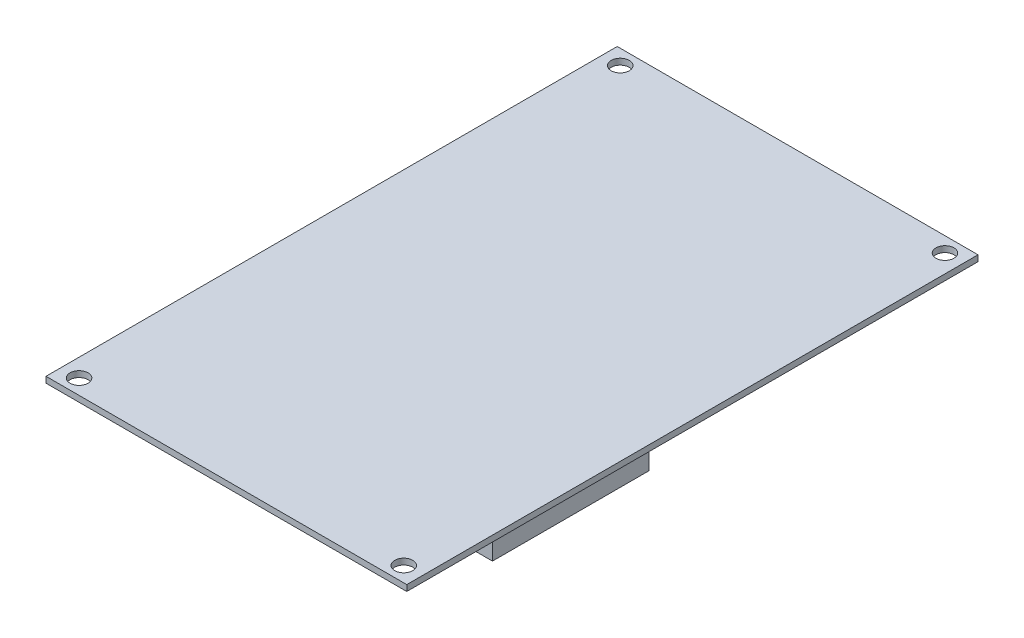
ISO-10303-21;
HEADER;
FILE_DESCRIPTION(('STEP AP214'),'2;1');
FILE_NAME('part.step','',(''),(''),'','','');
FILE_SCHEMA(('AUTOMOTIVE_DESIGN { 1 0 10303 214 1 1 1 1 }'));
ENDSEC;
DATA;
#1=APPLICATION_CONTEXT('core data for automotive mechanical design processes');
#2=APPLICATION_PROTOCOL_DEFINITION('international standard','automotive_design',2000,#1);
#3=PRODUCT_CONTEXT('',#1,'mechanical');
#4=PRODUCT('Part','Part','',(#3));
#5=PRODUCT_RELATED_PRODUCT_CATEGORY('part','',(#4));
#6=PRODUCT_DEFINITION_FORMATION('','',#4);
#7=PRODUCT_DEFINITION_CONTEXT('part definition',#1,'design');
#8=PRODUCT_DEFINITION('design','',#6,#7);
#9=PRODUCT_DEFINITION_SHAPE('','',#8);
#10=(LENGTH_UNIT() NAMED_UNIT(*) SI_UNIT(.MILLI.,.METRE.));
#11=(NAMED_UNIT(*) PLANE_ANGLE_UNIT() SI_UNIT($,.RADIAN.));
#12=(NAMED_UNIT(*) SI_UNIT($,.STERADIAN.) SOLID_ANGLE_UNIT());
#13=UNCERTAINTY_MEASURE_WITH_UNIT(LENGTH_MEASURE(1.E-05),#10,'distance_accuracy_value','');
#14=(GEOMETRIC_REPRESENTATION_CONTEXT(3) GLOBAL_UNCERTAINTY_ASSIGNED_CONTEXT((#13)) GLOBAL_UNIT_ASSIGNED_CONTEXT((#10,
#11,#12)) REPRESENTATION_CONTEXT('',''));
#15=CARTESIAN_POINT('',(0.,0.,0.));
#16=DIRECTION('',(0.,0.,1.));
#17=DIRECTION('',(1.,0.,0.));
#18=AXIS2_PLACEMENT_3D('',#15,#16,#17);
#19=CARTESIAN_POINT('',(0.,0.,0.));
#20=DIRECTION('',(0.,-1.,0.));
#21=DIRECTION('',(0.,0.,-1.));
#22=AXIS2_PLACEMENT_3D('',#19,#20,#21);
#23=PLANE('',#22);
#24=CARTESIAN_POINT('',(-27.,0.,-45.));
#25=DIRECTION('',(0.,-1.,0.));
#26=DIRECTION('',(0.,0.,-1.));
#27=AXIS2_PLACEMENT_3D('',#24,#25,#26);
#28=CIRCLE('',#27,1.5);
#29=CARTESIAN_POINT('',(-27.,0.,-46.5));
#30=VERTEX_POINT('',#29);
#31=EDGE_CURVE('E476',#30,#30,#28,.F.);
#32=ORIENTED_EDGE('',*,*,#31,.T.);
#33=EDGE_LOOP('',(#32));
#34=FACE_BOUND('',#33,.T.);
#35=CARTESIAN_POINT('',(27.,0.,-45.));
#36=DIRECTION('',(0.,-1.,0.));
#37=DIRECTION('',(0.,0.,-1.));
#38=AXIS2_PLACEMENT_3D('',#35,#36,#37);
#39=CIRCLE('',#38,1.5);
#40=CARTESIAN_POINT('',(27.,0.,-46.5));
#41=VERTEX_POINT('',#40);
#42=EDGE_CURVE('E477',#41,#41,#39,.F.);
#43=ORIENTED_EDGE('',*,*,#42,.T.);
#44=EDGE_LOOP('',(#43));
#45=FACE_BOUND('',#44,.T.);
#46=CARTESIAN_POINT('',(27.,0.,45.));
#47=DIRECTION('',(0.,-1.,0.));
#48=DIRECTION('',(0.,0.,-1.));
#49=AXIS2_PLACEMENT_3D('',#46,#47,#48);
#50=CIRCLE('',#49,1.5);
#51=CARTESIAN_POINT('',(27.,0.,43.5));
#52=VERTEX_POINT('',#51);
#53=EDGE_CURVE('E277',#52,#52,#50,.F.);
#54=ORIENTED_EDGE('',*,*,#53,.T.);
#55=EDGE_LOOP('',(#54));
#56=FACE_BOUND('',#55,.T.);
#57=CARTESIAN_POINT('',(-27.,0.,45.));
#58=DIRECTION('',(0.,-1.,0.));
#59=DIRECTION('',(0.,0.,-1.));
#60=AXIS2_PLACEMENT_3D('',#57,#58,#59);
#61=CIRCLE('',#60,1.5);
#62=CARTESIAN_POINT('',(-27.,0.,43.5));
#63=VERTEX_POINT('',#62);
#64=EDGE_CURVE('E270',#63,#63,#61,.F.);
#65=ORIENTED_EDGE('',*,*,#64,.T.);
#66=EDGE_LOOP('',(#65));
#67=FACE_BOUND('',#66,.T.);
#68=DIRECTION('',(-1.,0.,0.));
#69=VECTOR('',#68,1.);
#70=CARTESIAN_POINT('',(24.25,0.,27.5));
#71=LINE('',#70,#69);
#72=CARTESIAN_POINT('',(24.25,0.,27.5));
#73=VERTEX_POINT('',#72);
#74=CARTESIAN_POINT('',(19.25,0.,27.5));
#75=VERTEX_POINT('',#74);
#76=EDGE_CURVE('E154',#73,#75,#71,.T.);
#77=ORIENTED_EDGE('',*,*,#76,.F.);
#78=DIRECTION('',(0.,0.,1.));
#79=VECTOR('',#78,1.);
#80=CARTESIAN_POINT('',(24.25,0.,1.50000000000002));
#81=LINE('',#80,#79);
#82=CARTESIAN_POINT('',(24.25,0.,1.50000000000002));
#83=VERTEX_POINT('',#82);
#84=EDGE_CURVE('E151',#83,#73,#81,.T.);
#85=ORIENTED_EDGE('',*,*,#84,.F.);
#86=DIRECTION('',(1.,0.,0.));
#87=VECTOR('',#86,1.);
#88=CARTESIAN_POINT('',(24.25,0.,1.50000000000002));
#89=LINE('',#88,#87);
#90=CARTESIAN_POINT('',(19.25,0.,1.50000000000002));
#91=VERTEX_POINT('',#90);
#92=EDGE_CURVE('E163',#91,#83,#89,.T.);
#93=ORIENTED_EDGE('',*,*,#92,.F.);
#94=DIRECTION('',(0.,0.,-1.));
#95=VECTOR('',#94,1.);
#96=CARTESIAN_POINT('',(19.25,0.,1.50000000000002));
#97=LINE('',#96,#95);
#98=EDGE_CURVE('E171',#75,#91,#97,.T.);
#99=ORIENTED_EDGE('',*,*,#98,.F.);
#100=EDGE_LOOP('',(#77,#85,#93,#99));
#101=FACE_BOUND('',#100,.T.);
#102=DIRECTION('',(0.,0.,1.));
#103=VECTOR('',#102,1.);
#104=CARTESIAN_POINT('',(-30.,0.,-47.5));
#105=LINE('',#104,#103);
#106=CARTESIAN_POINT('',(-30.,0.,-47.5));
#107=VERTEX_POINT('',#106);
#108=CARTESIAN_POINT('',(-30.,0.,47.5));
#109=VERTEX_POINT('',#108);
#110=EDGE_CURVE('E182',#107,#109,#105,.T.);
#111=ORIENTED_EDGE('',*,*,#110,.F.);
#112=DIRECTION('',(-1.,0.,0.));
#113=VECTOR('',#112,1.);
#114=CARTESIAN_POINT('',(30.,0.,-47.5));
#115=LINE('',#114,#113);
#116=CARTESIAN_POINT('',(30.,0.,-47.5));
#117=VERTEX_POINT('',#116);
#118=EDGE_CURVE('E187',#117,#107,#115,.T.);
#119=ORIENTED_EDGE('',*,*,#118,.F.);
#120=DIRECTION('',(0.,0.,-1.));
#121=VECTOR('',#120,1.);
#122=CARTESIAN_POINT('',(30.,0.,-47.5));
#123=LINE('',#122,#121);
#124=CARTESIAN_POINT('',(30.,0.,47.5));
#125=VERTEX_POINT('',#124);
#126=EDGE_CURVE('E198',#125,#117,#123,.T.);
#127=ORIENTED_EDGE('',*,*,#126,.F.);
#128=DIRECTION('',(1.,0.,0.));
#129=VECTOR('',#128,1.);
#130=CARTESIAN_POINT('',(30.,0.,47.5));
#131=LINE('',#130,#129);
#132=EDGE_CURVE('E196',#109,#125,#131,.T.);
#133=ORIENTED_EDGE('',*,*,#132,.F.);
#134=EDGE_LOOP('',(#111,#119,#127,#133));
#135=FACE_BOUND('',#134,.T.);
#136=DIRECTION('',(-1.,0.,0.));
#137=VECTOR('',#136,1.);
#138=CARTESIAN_POINT('',(-19.25,0.,27.5));
#139=LINE('',#138,#137);
#140=CARTESIAN_POINT('',(-19.25,0.,27.5));
#141=VERTEX_POINT('',#140);
#142=CARTESIAN_POINT('',(-24.25,0.,27.5));
#143=VERTEX_POINT('',#142);
#144=EDGE_CURVE('E272',#141,#143,#139,.T.);
#145=ORIENTED_EDGE('',*,*,#144,.F.);
#146=DIRECTION('',(0.,0.,1.));
#147=VECTOR('',#146,1.);
#148=CARTESIAN_POINT('',(-19.25,0.,1.50000000000001));
#149=LINE('',#148,#147);
#150=CARTESIAN_POINT('',(-19.25,0.,1.50000000000001));
#151=VERTEX_POINT('',#150);
#152=EDGE_CURVE('E149',#151,#141,#149,.T.);
#153=ORIENTED_EDGE('',*,*,#152,.F.);
#154=DIRECTION('',(1.,0.,0.));
#155=VECTOR('',#154,1.);
#156=CARTESIAN_POINT('',(-19.25,0.,1.50000000000001));
#157=LINE('',#156,#155);
#158=CARTESIAN_POINT('',(-24.25,0.,1.50000000000001));
#159=VERTEX_POINT('',#158);
#160=EDGE_CURVE('E145',#159,#151,#157,.T.);
#161=ORIENTED_EDGE('',*,*,#160,.F.);
#162=DIRECTION('',(0.,0.,-1.));
#163=VECTOR('',#162,1.);
#164=CARTESIAN_POINT('',(-24.25,0.,1.50000000000001));
#165=LINE('',#164,#163);
#166=EDGE_CURVE('E284',#143,#159,#165,.T.);
#167=ORIENTED_EDGE('',*,*,#166,.F.);
#168=EDGE_LOOP('',(#145,#153,#161,#167));
#169=FACE_BOUND('',#168,.T.);
#170=ADVANCED_FACE('F36',(#34,#45,#56,#67,#101,#135,#169),#23,.T.);
#171=CARTESIAN_POINT('',(-30.,1.,-47.5));
#172=DIRECTION('',(1.,0.,0.));
#173=DIRECTION('',(0.,0.,-1.));
#174=AXIS2_PLACEMENT_3D('',#171,#172,#173);
#175=PLANE('',#174);
#176=ORIENTED_EDGE('',*,*,#110,.T.);
#177=DIRECTION('',(0.,-1.,0.));
#178=VECTOR('',#177,1.);
#179=CARTESIAN_POINT('',(-30.,1.,47.5));
#180=LINE('',#179,#178);
#181=CARTESIAN_POINT('',(-30.,1.,47.5));
#182=VERTEX_POINT('',#181);
#183=EDGE_CURVE('E11',#182,#109,#180,.T.);
#184=ORIENTED_EDGE('',*,*,#183,.F.);
#185=DIRECTION('',(0.,0.,1.));
#186=VECTOR('',#185,1.);
#187=CARTESIAN_POINT('',(-30.,1.,-47.5));
#188=LINE('',#187,#186);
#189=CARTESIAN_POINT('',(-30.,1.,-47.5));
#190=VERTEX_POINT('',#189);
#191=EDGE_CURVE('E183',#190,#182,#188,.T.);
#192=ORIENTED_EDGE('',*,*,#191,.F.);
#193=DIRECTION('',(0.,-1.,0.));
#194=VECTOR('',#193,1.);
#195=CARTESIAN_POINT('',(-30.,1.,-47.5));
#196=LINE('',#195,#194);
#197=EDGE_CURVE('E193',#190,#107,#196,.T.);
#198=ORIENTED_EDGE('',*,*,#197,.T.);
#199=EDGE_LOOP('',(#176,#184,#192,#198));
#200=FACE_BOUND('',#199,.T.);
#201=ADVANCED_FACE('F38',(#200),#175,.F.);
#202=CARTESIAN_POINT('',(30.,1.,47.5));
#203=DIRECTION('',(0.,0.,-1.));
#204=DIRECTION('',(-1.,0.,0.));
#205=AXIS2_PLACEMENT_3D('',#202,#203,#204);
#206=PLANE('',#205);
#207=ORIENTED_EDGE('',*,*,#132,.T.);
#208=DIRECTION('',(0.,-1.,0.));
#209=VECTOR('',#208,1.);
#210=CARTESIAN_POINT('',(30.,1.,47.5));
#211=LINE('',#210,#209);
#212=CARTESIAN_POINT('',(30.,1.,47.5));
#213=VERTEX_POINT('',#212);
#214=EDGE_CURVE('E44',#213,#125,#211,.T.);
#215=ORIENTED_EDGE('',*,*,#214,.F.);
#216=DIRECTION('',(1.,0.,0.));
#217=VECTOR('',#216,1.);
#218=CARTESIAN_POINT('',(30.,1.,47.5));
#219=LINE('',#218,#217);
#220=EDGE_CURVE('E186',#182,#213,#219,.T.);
#221=ORIENTED_EDGE('',*,*,#220,.F.);
#222=ORIENTED_EDGE('',*,*,#183,.T.);
#223=EDGE_LOOP('',(#207,#215,#221,#222));
#224=FACE_BOUND('',#223,.T.);
#225=ADVANCED_FACE('F226',(#224),#206,.F.);
#226=CARTESIAN_POINT('',(30.,1.,-47.5));
#227=DIRECTION('',(-1.,0.,0.));
#228=DIRECTION('',(0.,0.,1.));
#229=AXIS2_PLACEMENT_3D('',#226,#227,#228);
#230=PLANE('',#229);
#231=ORIENTED_EDGE('',*,*,#126,.T.);
#232=DIRECTION('',(0.,-1.,0.));
#233=VECTOR('',#232,1.);
#234=CARTESIAN_POINT('',(30.,1.,-47.5));
#235=LINE('',#234,#233);
#236=CARTESIAN_POINT('',(30.,1.,-47.5));
#237=VERTEX_POINT('',#236);
#238=EDGE_CURVE('E203',#237,#117,#235,.T.);
#239=ORIENTED_EDGE('',*,*,#238,.F.);
#240=DIRECTION('',(0.,0.,-1.));
#241=VECTOR('',#240,1.);
#242=CARTESIAN_POINT('',(30.,1.,-47.5));
#243=LINE('',#242,#241);
#244=EDGE_CURVE('E189',#213,#237,#243,.T.);
#245=ORIENTED_EDGE('',*,*,#244,.F.);
#246=ORIENTED_EDGE('',*,*,#214,.T.);
#247=EDGE_LOOP('',(#231,#239,#245,#246));
#248=FACE_BOUND('',#247,.T.);
#249=ADVANCED_FACE('F210',(#248),#230,.F.);
#250=CARTESIAN_POINT('',(30.,1.,-47.5));
#251=DIRECTION('',(0.,0.,1.));
#252=DIRECTION('',(1.,0.,0.));
#253=AXIS2_PLACEMENT_3D('',#250,#251,#252);
#254=PLANE('',#253);
#255=ORIENTED_EDGE('',*,*,#118,.T.);
#256=ORIENTED_EDGE('',*,*,#197,.F.);
#257=DIRECTION('',(-1.,0.,0.));
#258=VECTOR('',#257,1.);
#259=CARTESIAN_POINT('',(30.,1.,-47.5));
#260=LINE('',#259,#258);
#261=EDGE_CURVE('E191',#237,#190,#260,.T.);
#262=ORIENTED_EDGE('',*,*,#261,.F.);
#263=ORIENTED_EDGE('',*,*,#238,.T.);
#264=EDGE_LOOP('',(#255,#256,#262,#263));
#265=FACE_BOUND('',#264,.T.);
#266=ADVANCED_FACE('F219',(#265),#254,.F.);
#267=CARTESIAN_POINT('',(0.,1.,0.));
#268=DIRECTION('',(0.,-1.,0.));
#269=DIRECTION('',(0.,0.,-1.));
#270=AXIS2_PLACEMENT_3D('',#267,#268,#269);
#271=PLANE('',#270);
#272=CARTESIAN_POINT('',(-27.,1.,-45.));
#273=DIRECTION('',(0.,1.,0.));
#274=DIRECTION('',(0.,0.,1.));
#275=AXIS2_PLACEMENT_3D('',#272,#273,#274);
#276=CIRCLE('',#275,1.5);
#277=CARTESIAN_POINT('',(-27.,1.,-43.5));
#278=VERTEX_POINT('',#277);
#279=EDGE_CURVE('E257',#278,#278,#276,.T.);
#280=ORIENTED_EDGE('',*,*,#279,.F.);
#281=EDGE_LOOP('',(#280));
#282=FACE_BOUND('',#281,.T.);
#283=CARTESIAN_POINT('',(27.,1.,-45.));
#284=DIRECTION('',(0.,1.,0.));
#285=DIRECTION('',(0.,0.,1.));
#286=AXIS2_PLACEMENT_3D('',#283,#284,#285);
#287=CIRCLE('',#286,1.5);
#288=CARTESIAN_POINT('',(27.,1.,-43.5));
#289=VERTEX_POINT('',#288);
#290=EDGE_CURVE('E261',#289,#289,#287,.T.);
#291=ORIENTED_EDGE('',*,*,#290,.F.);
#292=EDGE_LOOP('',(#291));
#293=FACE_BOUND('',#292,.T.);
#294=CARTESIAN_POINT('',(27.,1.,45.));
#295=DIRECTION('',(0.,1.,0.));
#296=DIRECTION('',(0.,0.,1.));
#297=AXIS2_PLACEMENT_3D('',#294,#295,#296);
#298=CIRCLE('',#297,1.5);
#299=CARTESIAN_POINT('',(27.,1.,46.5));
#300=VERTEX_POINT('',#299);
#301=EDGE_CURVE('E265',#300,#300,#298,.T.);
#302=ORIENTED_EDGE('',*,*,#301,.F.);
#303=EDGE_LOOP('',(#302));
#304=FACE_BOUND('',#303,.T.);
#305=CARTESIAN_POINT('',(-27.,1.,45.));
#306=DIRECTION('',(0.,1.,0.));
#307=DIRECTION('',(0.,0.,1.));
#308=AXIS2_PLACEMENT_3D('',#305,#306,#307);
#309=CIRCLE('',#308,1.5);
#310=CARTESIAN_POINT('',(-27.,1.,46.5));
#311=VERTEX_POINT('',#310);
#312=EDGE_CURVE('E268',#311,#311,#309,.T.);
#313=ORIENTED_EDGE('',*,*,#312,.F.);
#314=EDGE_LOOP('',(#313));
#315=FACE_BOUND('',#314,.T.);
#316=ORIENTED_EDGE('',*,*,#191,.T.);
#317=ORIENTED_EDGE('',*,*,#220,.T.);
#318=ORIENTED_EDGE('',*,*,#244,.T.);
#319=ORIENTED_EDGE('',*,*,#261,.T.);
#320=EDGE_LOOP('',(#316,#317,#318,#319));
#321=FACE_BOUND('',#320,.T.);
#322=ADVANCED_FACE('F225',(#282,#293,#304,#315,#321),#271,.F.);
#323=CARTESIAN_POINT('',(24.25,-8.5,1.50000000000002));
#324=DIRECTION('',(-1.,0.,0.));
#325=DIRECTION('',(0.,0.,1.));
#326=AXIS2_PLACEMENT_3D('',#323,#324,#325);
#327=PLANE('',#326);
#328=ORIENTED_EDGE('',*,*,#84,.T.);
#329=DIRECTION('',(0.,1.,0.));
#330=VECTOR('',#329,1.);
#331=CARTESIAN_POINT('',(24.25,-8.5,27.5));
#332=LINE('',#331,#330);
#333=CARTESIAN_POINT('',(24.25,-8.5,27.5));
#334=VERTEX_POINT('',#333);
#335=EDGE_CURVE('E180',#334,#73,#332,.T.);
#336=ORIENTED_EDGE('',*,*,#335,.F.);
#337=DIRECTION('',(0.,0.,1.));
#338=VECTOR('',#337,1.);
#339=CARTESIAN_POINT('',(24.25,-8.5,1.50000000000002));
#340=LINE('',#339,#338);
#341=CARTESIAN_POINT('',(24.25,-8.5,1.50000000000002));
#342=VERTEX_POINT('',#341);
#343=EDGE_CURVE('E159',#342,#334,#340,.T.);
#344=ORIENTED_EDGE('',*,*,#343,.F.);
#345=DIRECTION('',(0.,1.,0.));
#346=VECTOR('',#345,1.);
#347=CARTESIAN_POINT('',(24.25,-8.5,1.50000000000002));
#348=LINE('',#347,#346);
#349=EDGE_CURVE('E168',#342,#83,#348,.T.);
#350=ORIENTED_EDGE('',*,*,#349,.T.);
#351=EDGE_LOOP('',(#328,#336,#344,#350));
#352=FACE_BOUND('',#351,.T.);
#353=ADVANCED_FACE('F247',(#352),#327,.F.);
#354=CARTESIAN_POINT('',(24.25,-8.5,27.5));
#355=DIRECTION('',(0.,0.,-1.));
#356=DIRECTION('',(-1.,0.,0.));
#357=AXIS2_PLACEMENT_3D('',#354,#355,#356);
#358=PLANE('',#357);
#359=ORIENTED_EDGE('',*,*,#76,.T.);
#360=DIRECTION('',(0.,1.,0.));
#361=VECTOR('',#360,1.);
#362=CARTESIAN_POINT('',(19.25,-8.5,27.5));
#363=LINE('',#362,#361);
#364=CARTESIAN_POINT('',(19.25,-8.5,27.5));
#365=VERTEX_POINT('',#364);
#366=EDGE_CURVE('E177',#365,#75,#363,.T.);
#367=ORIENTED_EDGE('',*,*,#366,.F.);
#368=DIRECTION('',(-1.,0.,0.));
#369=VECTOR('',#368,1.);
#370=CARTESIAN_POINT('',(24.25,-8.5,27.5));
#371=LINE('',#370,#369);
#372=EDGE_CURVE('E162',#334,#365,#371,.T.);
#373=ORIENTED_EDGE('',*,*,#372,.F.);
#374=ORIENTED_EDGE('',*,*,#335,.T.);
#375=EDGE_LOOP('',(#359,#367,#373,#374));
#376=FACE_BOUND('',#375,.T.);
#377=ADVANCED_FACE('F252',(#376),#358,.F.);
#378=CARTESIAN_POINT('',(19.25,-8.5,1.50000000000002));
#379=DIRECTION('',(1.,0.,0.));
#380=DIRECTION('',(0.,0.,-1.));
#381=AXIS2_PLACEMENT_3D('',#378,#379,#380);
#382=PLANE('',#381);
#383=ORIENTED_EDGE('',*,*,#98,.T.);
#384=DIRECTION('',(0.,1.,0.));
#385=VECTOR('',#384,1.);
#386=CARTESIAN_POINT('',(19.25,-8.5,1.50000000000002));
#387=LINE('',#386,#385);
#388=CARTESIAN_POINT('',(19.25,-8.5,1.50000000000002));
#389=VERTEX_POINT('',#388);
#390=EDGE_CURVE('E59',#389,#91,#387,.T.);
#391=ORIENTED_EDGE('',*,*,#390,.F.);
#392=DIRECTION('',(0.,0.,-1.));
#393=VECTOR('',#392,1.);
#394=CARTESIAN_POINT('',(19.25,-8.5,1.50000000000002));
#395=LINE('',#394,#393);
#396=EDGE_CURVE('E165',#365,#389,#395,.T.);
#397=ORIENTED_EDGE('',*,*,#396,.F.);
#398=ORIENTED_EDGE('',*,*,#366,.T.);
#399=EDGE_LOOP('',(#383,#391,#397,#398));
#400=FACE_BOUND('',#399,.T.);
#401=ADVANCED_FACE('F314',(#400),#382,.F.);
#402=CARTESIAN_POINT('',(24.25,-8.5,1.50000000000002));
#403=DIRECTION('',(0.,0.,1.));
#404=DIRECTION('',(1.,0.,0.));
#405=AXIS2_PLACEMENT_3D('',#402,#403,#404);
#406=PLANE('',#405);
#407=ORIENTED_EDGE('',*,*,#92,.T.);
#408=ORIENTED_EDGE('',*,*,#349,.F.);
#409=DIRECTION('',(1.,0.,0.));
#410=VECTOR('',#409,1.);
#411=CARTESIAN_POINT('',(24.25,-8.5,1.50000000000002));
#412=LINE('',#411,#410);
#413=EDGE_CURVE('E167',#389,#342,#412,.T.);
#414=ORIENTED_EDGE('',*,*,#413,.F.);
#415=ORIENTED_EDGE('',*,*,#390,.T.);
#416=EDGE_LOOP('',(#407,#408,#414,#415));
#417=FACE_BOUND('',#416,.T.);
#418=ADVANCED_FACE('F310',(#417),#406,.F.);
#419=CARTESIAN_POINT('',(0.,-8.5,0.));
#420=DIRECTION('',(0.,-1.,0.));
#421=DIRECTION('',(0.,0.,-1.));
#422=AXIS2_PLACEMENT_3D('',#419,#420,#421);
#423=PLANE('',#422);
#424=ORIENTED_EDGE('',*,*,#343,.T.);
#425=ORIENTED_EDGE('',*,*,#372,.T.);
#426=ORIENTED_EDGE('',*,*,#396,.T.);
#427=ORIENTED_EDGE('',*,*,#413,.T.);
#428=EDGE_LOOP('',(#424,#425,#426,#427));
#429=FACE_BOUND('',#428,.T.);
#430=ADVANCED_FACE('F307',(#429),#423,.T.);
#431=CARTESIAN_POINT('',(-19.25,-8.5,1.50000000000001));
#432=DIRECTION('',(-1.,0.,0.));
#433=DIRECTION('',(0.,0.,1.));
#434=AXIS2_PLACEMENT_3D('',#431,#432,#433);
#435=PLANE('',#434);
#436=ORIENTED_EDGE('',*,*,#152,.T.);
#437=DIRECTION('',(0.,1.,0.));
#438=VECTOR('',#437,1.);
#439=CARTESIAN_POINT('',(-19.25,-8.5,27.5));
#440=LINE('',#439,#438);
#441=CARTESIAN_POINT('',(-19.25,-8.5,27.5));
#442=VERTEX_POINT('',#441);
#443=EDGE_CURVE('E130',#442,#141,#440,.T.);
#444=ORIENTED_EDGE('',*,*,#443,.F.);
#445=DIRECTION('',(0.,0.,1.));
#446=VECTOR('',#445,1.);
#447=CARTESIAN_POINT('',(-19.25,-8.5,1.50000000000001));
#448=LINE('',#447,#446);
#449=CARTESIAN_POINT('',(-19.25,-8.5,1.50000000000001));
#450=VERTEX_POINT('',#449);
#451=EDGE_CURVE('E137',#450,#442,#448,.T.);
#452=ORIENTED_EDGE('',*,*,#451,.F.);
#453=DIRECTION('',(0.,1.,0.));
#454=VECTOR('',#453,1.);
#455=CARTESIAN_POINT('',(-19.25,-8.5,1.50000000000001));
#456=LINE('',#455,#454);
#457=EDGE_CURVE('E281',#450,#151,#456,.T.);
#458=ORIENTED_EDGE('',*,*,#457,.T.);
#459=EDGE_LOOP('',(#436,#444,#452,#458));
#460=FACE_BOUND('',#459,.T.);
#461=ADVANCED_FACE('F147',(#460),#435,.F.);
#462=CARTESIAN_POINT('',(-19.25,-8.5,27.5));
#463=DIRECTION('',(0.,0.,-1.));
#464=DIRECTION('',(-1.,0.,0.));
#465=AXIS2_PLACEMENT_3D('',#462,#463,#464);
#466=PLANE('',#465);
#467=ORIENTED_EDGE('',*,*,#144,.T.);
#468=DIRECTION('',(0.,1.,0.));
#469=VECTOR('',#468,1.);
#470=CARTESIAN_POINT('',(-24.25,-8.5,27.5));
#471=LINE('',#470,#469);
#472=CARTESIAN_POINT('',(-24.25,-8.5,27.5));
#473=VERTEX_POINT('',#472);
#474=EDGE_CURVE('E133',#473,#143,#471,.T.);
#475=ORIENTED_EDGE('',*,*,#474,.F.);
#476=DIRECTION('',(-1.,0.,0.));
#477=VECTOR('',#476,1.);
#478=CARTESIAN_POINT('',(-19.25,-8.5,27.5));
#479=LINE('',#478,#477);
#480=EDGE_CURVE('E126',#442,#473,#479,.T.);
#481=ORIENTED_EDGE('',*,*,#480,.F.);
#482=ORIENTED_EDGE('',*,*,#443,.T.);
#483=EDGE_LOOP('',(#467,#475,#481,#482));
#484=FACE_BOUND('',#483,.T.);
#485=ADVANCED_FACE('F128',(#484),#466,.F.);
#486=CARTESIAN_POINT('',(-24.25,-8.5,1.50000000000001));
#487=DIRECTION('',(1.,0.,0.));
#488=DIRECTION('',(0.,0.,-1.));
#489=AXIS2_PLACEMENT_3D('',#486,#487,#488);
#490=PLANE('',#489);
#491=ORIENTED_EDGE('',*,*,#166,.T.);
#492=DIRECTION('',(0.,1.,0.));
#493=VECTOR('',#492,1.);
#494=CARTESIAN_POINT('',(-24.25,-8.5,1.50000000000001));
#495=LINE('',#494,#493);
#496=CARTESIAN_POINT('',(-24.25,-8.5,1.50000000000001));
#497=VERTEX_POINT('',#496);
#498=EDGE_CURVE('E51',#497,#159,#495,.T.);
#499=ORIENTED_EDGE('',*,*,#498,.F.);
#500=DIRECTION('',(0.,0.,-1.));
#501=VECTOR('',#500,1.);
#502=CARTESIAN_POINT('',(-24.25,-8.5,1.50000000000001));
#503=LINE('',#502,#501);
#504=EDGE_CURVE('E136',#473,#497,#503,.T.);
#505=ORIENTED_EDGE('',*,*,#504,.F.);
#506=ORIENTED_EDGE('',*,*,#474,.T.);
#507=EDGE_LOOP('',(#491,#499,#505,#506));
#508=FACE_BOUND('',#507,.T.);
#509=ADVANCED_FACE('F290',(#508),#490,.F.);
#510=CARTESIAN_POINT('',(-19.25,-8.5,1.50000000000001));
#511=DIRECTION('',(0.,0.,1.));
#512=DIRECTION('',(1.,0.,0.));
#513=AXIS2_PLACEMENT_3D('',#510,#511,#512);
#514=PLANE('',#513);
#515=ORIENTED_EDGE('',*,*,#160,.T.);
#516=ORIENTED_EDGE('',*,*,#457,.F.);
#517=DIRECTION('',(1.,0.,0.));
#518=VECTOR('',#517,1.);
#519=CARTESIAN_POINT('',(-19.25,-8.5,1.50000000000001));
#520=LINE('',#519,#518);
#521=EDGE_CURVE('E141',#497,#450,#520,.T.);
#522=ORIENTED_EDGE('',*,*,#521,.F.);
#523=ORIENTED_EDGE('',*,*,#498,.T.);
#524=EDGE_LOOP('',(#515,#516,#522,#523));
#525=FACE_BOUND('',#524,.T.);
#526=ADVANCED_FACE('F291',(#525),#514,.F.);
#527=CARTESIAN_POINT('',(0.,-8.5,0.));
#528=DIRECTION('',(0.,-1.,0.));
#529=DIRECTION('',(0.,0.,-1.));
#530=AXIS2_PLACEMENT_3D('',#527,#528,#529);
#531=PLANE('',#530);
#532=ORIENTED_EDGE('',*,*,#451,.T.);
#533=ORIENTED_EDGE('',*,*,#480,.T.);
#534=ORIENTED_EDGE('',*,*,#504,.T.);
#535=ORIENTED_EDGE('',*,*,#521,.T.);
#536=EDGE_LOOP('',(#532,#533,#534,#535));
#537=FACE_BOUND('',#536,.T.);
#538=ADVANCED_FACE('F140',(#537),#531,.T.);
#539=CARTESIAN_POINT('',(-27.,-8.501,45.));
#540=DIRECTION('',(0.,1.,0.));
#541=DIRECTION('',(0.,0.,1.));
#542=AXIS2_PLACEMENT_3D('',#539,#540,#541);
#543=CYLINDRICAL_SURFACE('',#542,1.5);
#544=ORIENTED_EDGE('',*,*,#64,.F.);
#545=EDGE_LOOP('',(#544));
#546=FACE_BOUND('',#545,.T.);
#547=ORIENTED_EDGE('',*,*,#312,.T.);
#548=EDGE_LOOP('',(#547));
#549=FACE_BOUND('',#548,.T.);
#550=ADVANCED_FACE('F298',(#546,#549),#543,.F.);
#551=CARTESIAN_POINT('',(27.,-8.501,45.));
#552=DIRECTION('',(0.,1.,0.));
#553=DIRECTION('',(0.,0.,1.));
#554=AXIS2_PLACEMENT_3D('',#551,#552,#553);
#555=CYLINDRICAL_SURFACE('',#554,1.5);
#556=ORIENTED_EDGE('',*,*,#53,.F.);
#557=EDGE_LOOP('',(#556));
#558=FACE_BOUND('',#557,.T.);
#559=ORIENTED_EDGE('',*,*,#301,.T.);
#560=EDGE_LOOP('',(#559));
#561=FACE_BOUND('',#560,.T.);
#562=ADVANCED_FACE('F376',(#558,#561),#555,.F.);
#563=CARTESIAN_POINT('',(27.,-8.501,-45.));
#564=DIRECTION('',(0.,1.,0.));
#565=DIRECTION('',(0.,0.,1.));
#566=AXIS2_PLACEMENT_3D('',#563,#564,#565);
#567=CYLINDRICAL_SURFACE('',#566,1.5);
#568=ORIENTED_EDGE('',*,*,#42,.F.);
#569=EDGE_LOOP('',(#568));
#570=FACE_BOUND('',#569,.T.);
#571=ORIENTED_EDGE('',*,*,#290,.T.);
#572=EDGE_LOOP('',(#571));
#573=FACE_BOUND('',#572,.T.);
#574=ADVANCED_FACE('F383',(#570,#573),#567,.F.);
#575=CARTESIAN_POINT('',(-27.,-8.501,-45.));
#576=DIRECTION('',(0.,1.,0.));
#577=DIRECTION('',(0.,0.,1.));
#578=AXIS2_PLACEMENT_3D('',#575,#576,#577);
#579=CYLINDRICAL_SURFACE('',#578,1.5);
#580=ORIENTED_EDGE('',*,*,#31,.F.);
#581=EDGE_LOOP('',(#580));
#582=FACE_BOUND('',#581,.T.);
#583=ORIENTED_EDGE('',*,*,#279,.T.);
#584=EDGE_LOOP('',(#583));
#585=FACE_BOUND('',#584,.T.);
#586=ADVANCED_FACE('F391',(#582,#585),#579,.F.);
#587=CLOSED_SHELL('',(#170,#201,#225,#249,#266,#322,#353,#377,#401,#418,#430,#461,#485,#509,
#526,#538,#550,#562,#574,#586));
#588=MANIFOLD_SOLID_BREP('B2',#587);
#589=ADVANCED_BREP_SHAPE_REPRESENTATION('',(#18,#588),#14);
#590=SHAPE_DEFINITION_REPRESENTATION(#9,#589);
ENDSEC;
END-ISO-10303-21;
